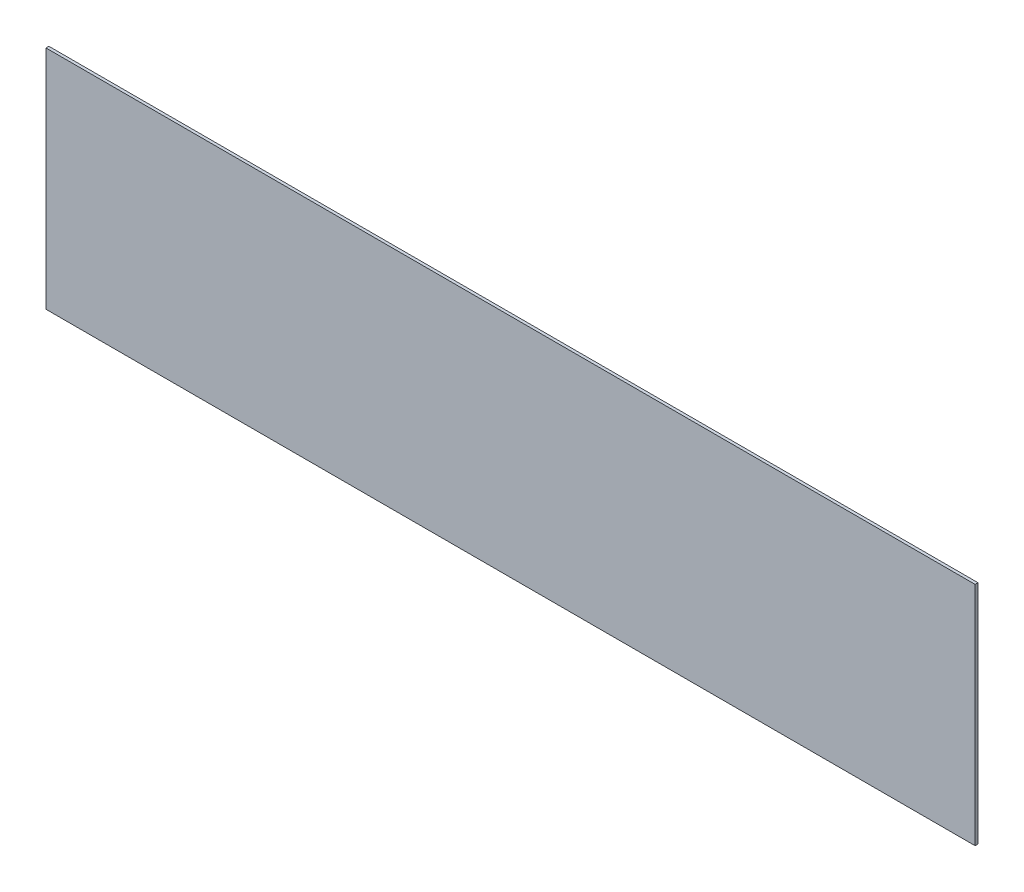
ISO-10303-21;
HEADER;
FILE_DESCRIPTION(('STEP AP214'),'2;1');
FILE_NAME('part.step','',(''),(''),'','','');
FILE_SCHEMA(('AUTOMOTIVE_DESIGN { 1 0 10303 214 1 1 1 1 }'));
ENDSEC;
DATA;
#1=APPLICATION_CONTEXT('core data for automotive mechanical design processes');
#2=APPLICATION_PROTOCOL_DEFINITION('international standard','automotive_design',2000,#1);
#3=PRODUCT_CONTEXT('',#1,'mechanical');
#4=PRODUCT('Part','Part','',(#3));
#5=PRODUCT_RELATED_PRODUCT_CATEGORY('part','',(#4));
#6=PRODUCT_DEFINITION_FORMATION('','',#4);
#7=PRODUCT_DEFINITION_CONTEXT('part definition',#1,'design');
#8=PRODUCT_DEFINITION('design','',#6,#7);
#9=PRODUCT_DEFINITION_SHAPE('','',#8);
#10=(LENGTH_UNIT() NAMED_UNIT(*) SI_UNIT(.MILLI.,.METRE.));
#11=(NAMED_UNIT(*) PLANE_ANGLE_UNIT() SI_UNIT($,.RADIAN.));
#12=(NAMED_UNIT(*) SI_UNIT($,.STERADIAN.) SOLID_ANGLE_UNIT());
#13=UNCERTAINTY_MEASURE_WITH_UNIT(LENGTH_MEASURE(1.E-05),#10,'distance_accuracy_value','');
#14=(GEOMETRIC_REPRESENTATION_CONTEXT(3) GLOBAL_UNCERTAINTY_ASSIGNED_CONTEXT((#13)) GLOBAL_UNIT_ASSIGNED_CONTEXT((#10,
#11,#12)) REPRESENTATION_CONTEXT('',''));
#15=CARTESIAN_POINT('',(0.,0.,0.));
#16=DIRECTION('',(0.,0.,1.));
#17=DIRECTION('',(1.,0.,0.));
#18=AXIS2_PLACEMENT_3D('',#15,#16,#17);
#19=CARTESIAN_POINT('',(16.664549560547,22.197199707031,0.0127));
#20=DIRECTION('',(0.,0.,1.));
#21=DIRECTION('',(1.,0.,0.));
#22=AXIS2_PLACEMENT_3D('',#19,#20,#21);
#23=PLANE('',#22);
#24=DIRECTION('',(0.,1.,0.));
#25=VECTOR('',#24,1.);
#26=CARTESIAN_POINT('',(18.705599365234,22.694399414062,0.0127));
#27=LINE('',#26,#25);
#28=CARTESIAN_POINT('',(18.705599365234,21.7,0.0127));
#29=VERTEX_POINT('',#28);
#30=CARTESIAN_POINT('',(18.705599365234,22.694399414062,0.0127));
#31=VERTEX_POINT('',#30);
#32=EDGE_CURVE('E27',#29,#31,#27,.T.);
#33=ORIENTED_EDGE('',*,*,#32,.T.);
#34=DIRECTION('',(-1.,0.,0.));
#35=VECTOR('',#34,1.);
#36=CARTESIAN_POINT('',(14.623499755859,22.694399414062,0.0127));
#37=LINE('',#36,#35);
#38=CARTESIAN_POINT('',(14.623499755859,22.694399414062,0.0127));
#39=VERTEX_POINT('',#38);
#40=EDGE_CURVE('E100',#31,#39,#37,.T.);
#41=ORIENTED_EDGE('',*,*,#40,.T.);
#42=DIRECTION('',(0.,-1.,0.));
#43=VECTOR('',#42,1.);
#44=CARTESIAN_POINT('',(14.623499755859,22.197199707031,0.0127));
#45=LINE('',#44,#43);
#46=CARTESIAN_POINT('',(14.623499755859,21.7,0.0127));
#47=VERTEX_POINT('',#46);
#48=EDGE_CURVE('E73',#39,#47,#45,.T.);
#49=ORIENTED_EDGE('',*,*,#48,.T.);
#50=DIRECTION('',(1.,0.,0.));
#51=VECTOR('',#50,1.);
#52=CARTESIAN_POINT('',(18.705599365234,21.7,0.0127));
#53=LINE('',#52,#51);
#54=EDGE_CURVE('E11',#47,#29,#53,.T.);
#55=ORIENTED_EDGE('',*,*,#54,.T.);
#56=EDGE_LOOP('',(#33,#41,#49,#55));
#57=FACE_BOUND('',#56,.T.);
#58=ADVANCED_FACE('F17',(#57),#23,.T.);
#59=CARTESIAN_POINT('',(18.705599365234,21.7,0.));
#60=DIRECTION('',(0.,1.,0.));
#61=DIRECTION('',(1.,0.,0.));
#62=AXIS2_PLACEMENT_3D('',#59,#60,#61);
#63=PLANE('',#62);
#64=DIRECTION('',(0.,0.,-1.));
#65=VECTOR('',#64,1.);
#66=CARTESIAN_POINT('',(14.623499755859,21.7,0.));
#67=LINE('',#66,#65);
#68=CARTESIAN_POINT('',(14.623499755859,21.7,0.));
#69=VERTEX_POINT('',#68);
#70=EDGE_CURVE('E20',#47,#69,#67,.T.);
#71=ORIENTED_EDGE('',*,*,#70,.T.);
#72=DIRECTION('',(1.,0.,0.));
#73=VECTOR('',#72,1.);
#74=CARTESIAN_POINT('',(16.664549560547,21.7,0.));
#75=LINE('',#74,#73);
#76=CARTESIAN_POINT('',(18.705599365234,21.7,0.));
#77=VERTEX_POINT('',#76);
#78=EDGE_CURVE('E68',#69,#77,#75,.T.);
#79=ORIENTED_EDGE('',*,*,#78,.T.);
#80=DIRECTION('',(0.,0.,1.));
#81=VECTOR('',#80,1.);
#82=CARTESIAN_POINT('',(18.705599365234,21.7,0.));
#83=LINE('',#82,#81);
#84=EDGE_CURVE('E114',#77,#29,#83,.T.);
#85=ORIENTED_EDGE('',*,*,#84,.T.);
#86=ORIENTED_EDGE('',*,*,#54,.F.);
#87=EDGE_LOOP('',(#71,#79,#85,#86));
#88=FACE_BOUND('',#87,.T.);
#89=ADVANCED_FACE('F65',(#88),#63,.F.);
#90=CARTESIAN_POINT('',(18.705599365234,22.694399414062,0.));
#91=DIRECTION('',(-1.,0.,0.));
#92=DIRECTION('',(0.,0.,1.));
#93=AXIS2_PLACEMENT_3D('',#90,#91,#92);
#94=PLANE('',#93);
#95=ORIENTED_EDGE('',*,*,#84,.F.);
#96=DIRECTION('',(0.,1.,0.));
#97=VECTOR('',#96,1.);
#98=CARTESIAN_POINT('',(18.705599365234,22.197199707031,0.));
#99=LINE('',#98,#97);
#100=CARTESIAN_POINT('',(18.705599365234,22.694399414062,0.));
#101=VERTEX_POINT('',#100);
#102=EDGE_CURVE('E87',#77,#101,#99,.T.);
#103=ORIENTED_EDGE('',*,*,#102,.T.);
#104=DIRECTION('',(0.,0.,1.));
#105=VECTOR('',#104,1.);
#106=CARTESIAN_POINT('',(18.705599365234,22.694399414062,0.));
#107=LINE('',#106,#105);
#108=EDGE_CURVE('E97',#101,#31,#107,.T.);
#109=ORIENTED_EDGE('',*,*,#108,.T.);
#110=ORIENTED_EDGE('',*,*,#32,.F.);
#111=EDGE_LOOP('',(#95,#103,#109,#110));
#112=FACE_BOUND('',#111,.T.);
#113=ADVANCED_FACE('F123',(#112),#94,.F.);
#114=CARTESIAN_POINT('',(14.623499755859,22.694399414062,0.));
#115=DIRECTION('',(0.,-1.,0.));
#116=DIRECTION('',(0.,0.,-1.));
#117=AXIS2_PLACEMENT_3D('',#114,#115,#116);
#118=PLANE('',#117);
#119=ORIENTED_EDGE('',*,*,#108,.F.);
#120=DIRECTION('',(-1.,0.,0.));
#121=VECTOR('',#120,1.);
#122=CARTESIAN_POINT('',(16.664549560547,22.694399414062,0.));
#123=LINE('',#122,#121);
#124=CARTESIAN_POINT('',(14.623499755859,22.694399414062,0.));
#125=VERTEX_POINT('',#124);
#126=EDGE_CURVE('E94',#101,#125,#123,.T.);
#127=ORIENTED_EDGE('',*,*,#126,.T.);
#128=DIRECTION('',(0.,0.,1.));
#129=VECTOR('',#128,1.);
#130=CARTESIAN_POINT('',(14.623499755859,22.694399414062,0.));
#131=LINE('',#130,#129);
#132=EDGE_CURVE('E74',#125,#39,#131,.T.);
#133=ORIENTED_EDGE('',*,*,#132,.T.);
#134=ORIENTED_EDGE('',*,*,#40,.F.);
#135=EDGE_LOOP('',(#119,#127,#133,#134));
#136=FACE_BOUND('',#135,.T.);
#137=ADVANCED_FACE('F106',(#136),#118,.F.);
#138=CARTESIAN_POINT('',(14.623499755859,21.7,0.));
#139=DIRECTION('',(1.,0.,0.));
#140=DIRECTION('',(0.,1.,0.));
#141=AXIS2_PLACEMENT_3D('',#138,#139,#140);
#142=PLANE('',#141);
#143=ORIENTED_EDGE('',*,*,#132,.F.);
#144=DIRECTION('',(0.,-1.,0.));
#145=VECTOR('',#144,1.);
#146=CARTESIAN_POINT('',(14.623499755859,22.197199707031,0.));
#147=LINE('',#146,#145);
#148=EDGE_CURVE('E77',#125,#69,#147,.T.);
#149=ORIENTED_EDGE('',*,*,#148,.T.);
#150=ORIENTED_EDGE('',*,*,#70,.F.);
#151=ORIENTED_EDGE('',*,*,#48,.F.);
#152=EDGE_LOOP('',(#143,#149,#150,#151));
#153=FACE_BOUND('',#152,.T.);
#154=ADVANCED_FACE('F78',(#153),#142,.F.);
#155=CARTESIAN_POINT('',(16.664549560547,22.197199707031,0.));
#156=DIRECTION('',(0.,0.,1.));
#157=DIRECTION('',(1.,0.,0.));
#158=AXIS2_PLACEMENT_3D('',#155,#156,#157);
#159=PLANE('',#158);
#160=ORIENTED_EDGE('',*,*,#126,.F.);
#161=ORIENTED_EDGE('',*,*,#102,.F.);
#162=ORIENTED_EDGE('',*,*,#78,.F.);
#163=ORIENTED_EDGE('',*,*,#148,.F.);
#164=EDGE_LOOP('',(#160,#161,#162,#163));
#165=FACE_BOUND('',#164,.T.);
#166=ADVANCED_FACE('F85',(#165),#159,.F.);
#167=CLOSED_SHELL('',(#58,#89,#113,#137,#154,#166));
#168=MANIFOLD_SOLID_BREP('B1',#167);
#169=ADVANCED_BREP_SHAPE_REPRESENTATION('',(#18,#168),#14);
#170=SHAPE_DEFINITION_REPRESENTATION(#9,#169);
ENDSEC;
END-ISO-10303-21;
